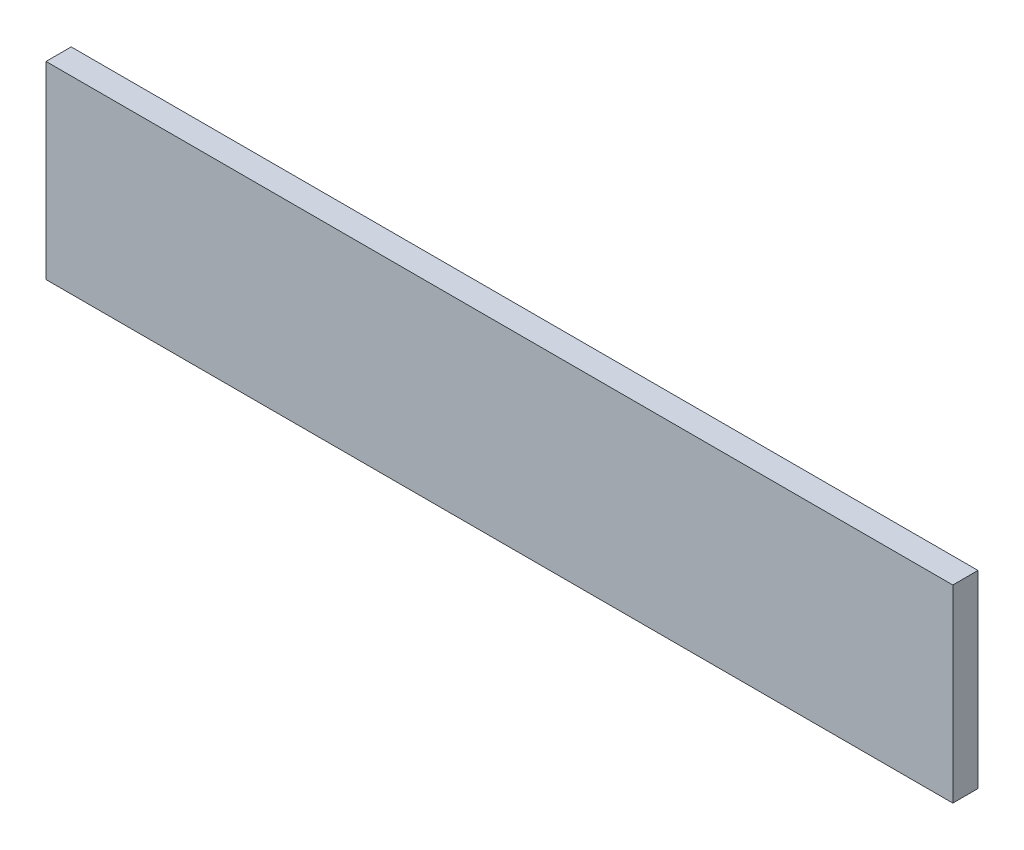
ISO-10303-21;
HEADER;
FILE_DESCRIPTION(('STEP AP214'),'2;1');
FILE_NAME('part.step','',(''),(''),'','','');
FILE_SCHEMA(('AUTOMOTIVE_DESIGN { 1 0 10303 214 1 1 1 1 }'));
ENDSEC;
DATA;
#1=APPLICATION_CONTEXT('core data for automotive mechanical design processes');
#2=APPLICATION_PROTOCOL_DEFINITION('international standard','automotive_design',2000,#1);
#3=PRODUCT_CONTEXT('',#1,'mechanical');
#4=PRODUCT('Part','Part','',(#3));
#5=PRODUCT_RELATED_PRODUCT_CATEGORY('part','',(#4));
#6=PRODUCT_DEFINITION_FORMATION('','',#4);
#7=PRODUCT_DEFINITION_CONTEXT('part definition',#1,'design');
#8=PRODUCT_DEFINITION('design','',#6,#7);
#9=PRODUCT_DEFINITION_SHAPE('','',#8);
#10=(LENGTH_UNIT() NAMED_UNIT(*) SI_UNIT(.MILLI.,.METRE.));
#11=(NAMED_UNIT(*) PLANE_ANGLE_UNIT() SI_UNIT($,.RADIAN.));
#12=(NAMED_UNIT(*) SI_UNIT($,.STERADIAN.) SOLID_ANGLE_UNIT());
#13=UNCERTAINTY_MEASURE_WITH_UNIT(LENGTH_MEASURE(1.E-05),#10,'distance_accuracy_value','');
#14=(GEOMETRIC_REPRESENTATION_CONTEXT(3) GLOBAL_UNCERTAINTY_ASSIGNED_CONTEXT((#13)) GLOBAL_UNIT_ASSIGNED_CONTEXT((#10,
#11,#12)) REPRESENTATION_CONTEXT('',''));
#15=CARTESIAN_POINT('',(0.,0.,0.));
#16=DIRECTION('',(0.,0.,1.));
#17=DIRECTION('',(1.,0.,0.));
#18=AXIS2_PLACEMENT_3D('',#15,#16,#17);
#19=CARTESIAN_POINT('',(36.,-7.5,2.));
#20=DIRECTION('',(-1.,0.,0.));
#21=DIRECTION('',(0.,0.,1.));
#22=AXIS2_PLACEMENT_3D('',#19,#20,#21);
#23=PLANE('',#22);
#24=DIRECTION('',(0.,1.,0.));
#25=VECTOR('',#24,1.);
#26=CARTESIAN_POINT('',(36.,-7.5,0.));
#27=LINE('',#26,#25);
#28=CARTESIAN_POINT('',(36.,-7.5,0.));
#29=VERTEX_POINT('',#28);
#30=CARTESIAN_POINT('',(36.,7.5,0.));
#31=VERTEX_POINT('',#30);
#32=EDGE_CURVE('E96',#29,#31,#27,.T.);
#33=ORIENTED_EDGE('',*,*,#32,.T.);
#34=DIRECTION('',(0.,0.,-1.));
#35=VECTOR('',#34,1.);
#36=CARTESIAN_POINT('',(36.,7.5,2.));
#37=LINE('',#36,#35);
#38=CARTESIAN_POINT('',(36.,7.5,2.));
#39=VERTEX_POINT('',#38);
#40=EDGE_CURVE('E11',#39,#31,#37,.T.);
#41=ORIENTED_EDGE('',*,*,#40,.F.);
#42=DIRECTION('',(0.,1.,0.));
#43=VECTOR('',#42,1.);
#44=CARTESIAN_POINT('',(36.,-7.5,2.));
#45=LINE('',#44,#43);
#46=CARTESIAN_POINT('',(36.,-7.5,2.));
#47=VERTEX_POINT('',#46);
#48=EDGE_CURVE('E84',#47,#39,#45,.T.);
#49=ORIENTED_EDGE('',*,*,#48,.F.);
#50=DIRECTION('',(0.,0.,-1.));
#51=VECTOR('',#50,1.);
#52=CARTESIAN_POINT('',(36.,-7.5,2.));
#53=LINE('',#52,#51);
#54=EDGE_CURVE('E92',#47,#29,#53,.T.);
#55=ORIENTED_EDGE('',*,*,#54,.T.);
#56=EDGE_LOOP('',(#33,#41,#49,#55));
#57=FACE_BOUND('',#56,.T.);
#58=ADVANCED_FACE('F33',(#57),#23,.F.);
#59=CARTESIAN_POINT('',(-36.,7.5,2.));
#60=DIRECTION('',(0.,-1.,0.));
#61=DIRECTION('',(0.,0.,-1.));
#62=AXIS2_PLACEMENT_3D('',#59,#60,#61);
#63=PLANE('',#62);
#64=DIRECTION('',(-1.,0.,0.));
#65=VECTOR('',#64,1.);
#66=CARTESIAN_POINT('',(-36.,7.5,0.));
#67=LINE('',#66,#65);
#68=CARTESIAN_POINT('',(-36.,7.5,0.));
#69=VERTEX_POINT('',#68);
#70=EDGE_CURVE('E88',#31,#69,#67,.T.);
#71=ORIENTED_EDGE('',*,*,#70,.T.);
#72=DIRECTION('',(0.,0.,-1.));
#73=VECTOR('',#72,1.);
#74=CARTESIAN_POINT('',(-36.,7.5,2.));
#75=LINE('',#74,#73);
#76=CARTESIAN_POINT('',(-36.,7.5,2.));
#77=VERTEX_POINT('',#76);
#78=EDGE_CURVE('E41',#77,#69,#75,.T.);
#79=ORIENTED_EDGE('',*,*,#78,.F.);
#80=DIRECTION('',(-1.,0.,0.));
#81=VECTOR('',#80,1.);
#82=CARTESIAN_POINT('',(-36.,7.5,2.));
#83=LINE('',#82,#81);
#84=EDGE_CURVE('E79',#39,#77,#83,.T.);
#85=ORIENTED_EDGE('',*,*,#84,.F.);
#86=ORIENTED_EDGE('',*,*,#40,.T.);
#87=EDGE_LOOP('',(#71,#79,#85,#86));
#88=FACE_BOUND('',#87,.T.);
#89=ADVANCED_FACE('F87',(#88),#63,.F.);
#90=CARTESIAN_POINT('',(-36.,-7.5,2.));
#91=DIRECTION('',(1.,0.,0.));
#92=DIRECTION('',(0.,0.,-1.));
#93=AXIS2_PLACEMENT_3D('',#90,#91,#92);
#94=PLANE('',#93);
#95=DIRECTION('',(0.,-1.,0.));
#96=VECTOR('',#95,1.);
#97=CARTESIAN_POINT('',(-36.,-7.5,0.));
#98=LINE('',#97,#96);
#99=CARTESIAN_POINT('',(-36.,-7.5,0.));
#100=VERTEX_POINT('',#99);
#101=EDGE_CURVE('E66',#69,#100,#98,.T.);
#102=ORIENTED_EDGE('',*,*,#101,.T.);
#103=DIRECTION('',(0.,0.,-1.));
#104=VECTOR('',#103,1.);
#105=CARTESIAN_POINT('',(-36.,-7.5,2.));
#106=LINE('',#105,#104);
#107=CARTESIAN_POINT('',(-36.,-7.5,2.));
#108=VERTEX_POINT('',#107);
#109=EDGE_CURVE('E89',#108,#100,#106,.T.);
#110=ORIENTED_EDGE('',*,*,#109,.F.);
#111=DIRECTION('',(0.,-1.,0.));
#112=VECTOR('',#111,1.);
#113=CARTESIAN_POINT('',(-36.,-7.5,2.));
#114=LINE('',#113,#112);
#115=EDGE_CURVE('E82',#77,#108,#114,.T.);
#116=ORIENTED_EDGE('',*,*,#115,.F.);
#117=ORIENTED_EDGE('',*,*,#78,.T.);
#118=EDGE_LOOP('',(#102,#110,#116,#117));
#119=FACE_BOUND('',#118,.T.);
#120=ADVANCED_FACE('F90',(#119),#94,.F.);
#121=CARTESIAN_POINT('',(-36.,-7.5,2.));
#122=DIRECTION('',(0.,1.,0.));
#123=DIRECTION('',(0.,0.,1.));
#124=AXIS2_PLACEMENT_3D('',#121,#122,#123);
#125=PLANE('',#124);
#126=DIRECTION('',(1.,0.,0.));
#127=VECTOR('',#126,1.);
#128=CARTESIAN_POINT('',(-36.,-7.5,0.));
#129=LINE('',#128,#127);
#130=EDGE_CURVE('E72',#100,#29,#129,.T.);
#131=ORIENTED_EDGE('',*,*,#130,.T.);
#132=ORIENTED_EDGE('',*,*,#54,.F.);
#133=DIRECTION('',(1.,0.,0.));
#134=VECTOR('',#133,1.);
#135=CARTESIAN_POINT('',(-36.,-7.5,2.));
#136=LINE('',#135,#134);
#137=EDGE_CURVE('E49',#108,#47,#136,.T.);
#138=ORIENTED_EDGE('',*,*,#137,.F.);
#139=ORIENTED_EDGE('',*,*,#109,.T.);
#140=EDGE_LOOP('',(#131,#132,#138,#139));
#141=FACE_BOUND('',#140,.T.);
#142=ADVANCED_FACE('F103',(#141),#125,.F.);
#143=CARTESIAN_POINT('',(0.,0.,2.));
#144=DIRECTION('',(0.,0.,-1.));
#145=DIRECTION('',(-1.,0.,0.));
#146=AXIS2_PLACEMENT_3D('',#143,#144,#145);
#147=PLANE('',#146);
#148=ORIENTED_EDGE('',*,*,#48,.T.);
#149=ORIENTED_EDGE('',*,*,#84,.T.);
#150=ORIENTED_EDGE('',*,*,#115,.T.);
#151=ORIENTED_EDGE('',*,*,#137,.T.);
#152=EDGE_LOOP('',(#148,#149,#150,#151));
#153=FACE_BOUND('',#152,.T.);
#154=ADVANCED_FACE('F80',(#153),#147,.F.);
#155=CARTESIAN_POINT('',(0.,0.,0.));
#156=DIRECTION('',(0.,0.,-1.));
#157=DIRECTION('',(-1.,0.,0.));
#158=AXIS2_PLACEMENT_3D('',#155,#156,#157);
#159=PLANE('',#158);
#160=ORIENTED_EDGE('',*,*,#32,.F.);
#161=ORIENTED_EDGE('',*,*,#130,.F.);
#162=ORIENTED_EDGE('',*,*,#101,.F.);
#163=ORIENTED_EDGE('',*,*,#70,.F.);
#164=EDGE_LOOP('',(#160,#161,#162,#163));
#165=FACE_BOUND('',#164,.T.);
#166=ADVANCED_FACE('F106',(#165),#159,.T.);
#167=CLOSED_SHELL('',(#58,#89,#120,#142,#154,#166));
#168=MANIFOLD_SOLID_BREP('B2',#167);
#169=ADVANCED_BREP_SHAPE_REPRESENTATION('',(#18,#168),#14);
#170=SHAPE_DEFINITION_REPRESENTATION(#9,#169);
ENDSEC;
END-ISO-10303-21;
